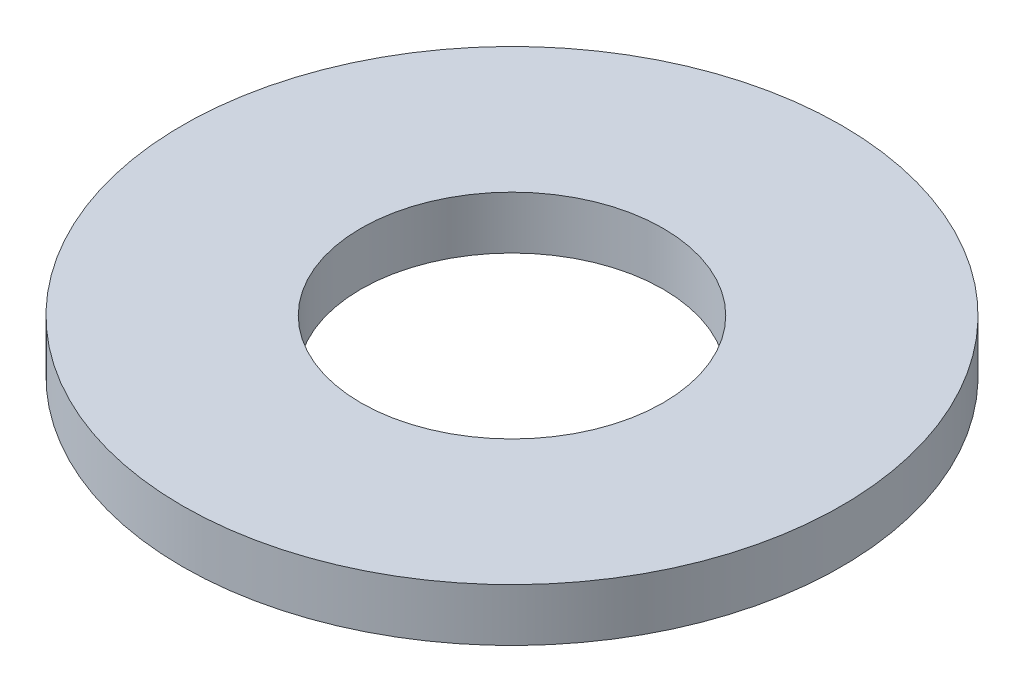
ISO-10303-21;
HEADER;
FILE_DESCRIPTION(('STEP AP214'),'2;1');
FILE_NAME('part.step','',(''),(''),'','','');
FILE_SCHEMA(('AUTOMOTIVE_DESIGN { 1 0 10303 214 1 1 1 1 }'));
ENDSEC;
DATA;
#1=APPLICATION_CONTEXT('core data for automotive mechanical design processes');
#2=APPLICATION_PROTOCOL_DEFINITION('international standard','automotive_design',2000,#1);
#3=PRODUCT_CONTEXT('',#1,'mechanical');
#4=PRODUCT('Part','Part','',(#3));
#5=PRODUCT_RELATED_PRODUCT_CATEGORY('part','',(#4));
#6=PRODUCT_DEFINITION_FORMATION('','',#4);
#7=PRODUCT_DEFINITION_CONTEXT('part definition',#1,'design');
#8=PRODUCT_DEFINITION('design','',#6,#7);
#9=PRODUCT_DEFINITION_SHAPE('','',#8);
#10=(LENGTH_UNIT() NAMED_UNIT(*) SI_UNIT(.MILLI.,.METRE.));
#11=(NAMED_UNIT(*) PLANE_ANGLE_UNIT() SI_UNIT($,.RADIAN.));
#12=(NAMED_UNIT(*) SI_UNIT($,.STERADIAN.) SOLID_ANGLE_UNIT());
#13=UNCERTAINTY_MEASURE_WITH_UNIT(LENGTH_MEASURE(1.E-05),#10,'distance_accuracy_value','');
#14=(GEOMETRIC_REPRESENTATION_CONTEXT(3) GLOBAL_UNCERTAINTY_ASSIGNED_CONTEXT((#13)) GLOBAL_UNIT_ASSIGNED_CONTEXT((#10,
#11,#12)) REPRESENTATION_CONTEXT('',''));
#15=CARTESIAN_POINT('',(0.,0.,0.));
#16=DIRECTION('',(0.,0.,1.));
#17=DIRECTION('',(1.,0.,0.));
#18=AXIS2_PLACEMENT_3D('',#15,#16,#17);
#19=CARTESIAN_POINT('',(0.,1.524,0.));
#20=DIRECTION('',(0.,-1.,0.));
#21=DIRECTION('',(0.,0.,-1.));
#22=AXIS2_PLACEMENT_3D('',#19,#20,#21);
#23=CYLINDRICAL_SURFACE('',#22,9.525);
#24=CARTESIAN_POINT('',(0.,1.524,0.));
#25=DIRECTION('',(0.,1.,0.));
#26=DIRECTION('',(0.,0.,1.));
#27=AXIS2_PLACEMENT_3D('',#24,#25,#26);
#28=CIRCLE('',#27,9.525);
#29=CARTESIAN_POINT('',(0.,1.524,-9.525));
#30=VERTEX_POINT('',#29);
#31=EDGE_CURVE('E10',#30,#30,#28,.T.);
#32=CARTESIAN_POINT('',(0.,0.,0.));
#33=DIRECTION('',(0.,1.,0.));
#34=DIRECTION('',(0.,0.,1.));
#35=AXIS2_PLACEMENT_3D('',#32,#33,#34);
#36=CIRCLE('',#35,9.525);
#37=CARTESIAN_POINT('',(0.,0.,-9.525));
#38=VERTEX_POINT('',#37);
#39=EDGE_CURVE('E40',#38,#38,#36,.T.);
#40=CARTESIAN_POINT('',(0.,1.524,-9.525));
#41=CARTESIAN_POINT('',(0.,1.508125,-9.525));
#42=CARTESIAN_POINT('',(0.,1.49225,-9.525));
#43=CARTESIAN_POINT('',(0.,1.4605,-9.525));
#44=CARTESIAN_POINT('',(0.,1.444625,-9.525));
#45=CARTESIAN_POINT('',(0.,1.412875,-9.525));
#46=CARTESIAN_POINT('',(0.,1.397,-9.525));
#47=CARTESIAN_POINT('',(0.,1.36525,-9.525));
#48=CARTESIAN_POINT('',(0.,1.349375,-9.525));
#49=CARTESIAN_POINT('',(0.,1.317625,-9.525));
#50=CARTESIAN_POINT('',(0.,1.30175,-9.525));
#51=CARTESIAN_POINT('',(0.,1.27,-9.525));
#52=CARTESIAN_POINT('',(0.,1.254125,-9.525));
#53=CARTESIAN_POINT('',(0.,1.222375,-9.525));
#54=CARTESIAN_POINT('',(0.,1.2065,-9.525));
#55=CARTESIAN_POINT('',(0.,1.17475,-9.525));
#56=CARTESIAN_POINT('',(0.,1.158875,-9.525));
#57=CARTESIAN_POINT('',(0.,1.127125,-9.525));
#58=CARTESIAN_POINT('',(0.,1.11125,-9.525));
#59=CARTESIAN_POINT('',(0.,1.0795,-9.525));
#60=CARTESIAN_POINT('',(0.,1.063625,-9.525));
#61=CARTESIAN_POINT('',(0.,1.031875,-9.525));
#62=CARTESIAN_POINT('',(0.,1.016,-9.525));
#63=CARTESIAN_POINT('',(0.,0.98425,-9.525));
#64=CARTESIAN_POINT('',(0.,0.968375,-9.525));
#65=CARTESIAN_POINT('',(0.,0.936625,-9.525));
#66=CARTESIAN_POINT('',(0.,0.92075,-9.525));
#67=CARTESIAN_POINT('',(0.,0.889,-9.525));
#68=CARTESIAN_POINT('',(0.,0.873125,-9.525));
#69=CARTESIAN_POINT('',(0.,0.841375,-9.525));
#70=CARTESIAN_POINT('',(0.,0.8255,-9.525));
#71=CARTESIAN_POINT('',(0.,0.79375,-9.525));
#72=CARTESIAN_POINT('',(0.,0.777875,-9.525));
#73=CARTESIAN_POINT('',(0.,0.746125,-9.525));
#74=CARTESIAN_POINT('',(0.,0.73025,-9.525));
#75=CARTESIAN_POINT('',(0.,0.6985,-9.525));
#76=CARTESIAN_POINT('',(0.,0.682625,-9.525));
#77=CARTESIAN_POINT('',(0.,0.650875,-9.525));
#78=CARTESIAN_POINT('',(0.,0.635,-9.525));
#79=CARTESIAN_POINT('',(0.,0.60325,-9.525));
#80=CARTESIAN_POINT('',(0.,0.587375,-9.525));
#81=CARTESIAN_POINT('',(0.,0.555625,-9.525));
#82=CARTESIAN_POINT('',(0.,0.53975,-9.525));
#83=CARTESIAN_POINT('',(0.,0.508,-9.525));
#84=CARTESIAN_POINT('',(0.,0.492125,-9.525));
#85=CARTESIAN_POINT('',(0.,0.460375,-9.525));
#86=CARTESIAN_POINT('',(0.,0.4445,-9.525));
#87=CARTESIAN_POINT('',(0.,0.41275,-9.525));
#88=CARTESIAN_POINT('',(0.,0.396875,-9.525));
#89=CARTESIAN_POINT('',(0.,0.365125,-9.525));
#90=CARTESIAN_POINT('',(0.,0.34925,-9.525));
#91=CARTESIAN_POINT('',(0.,0.3175,-9.525));
#92=CARTESIAN_POINT('',(0.,0.301625,-9.525));
#93=CARTESIAN_POINT('',(0.,0.269875,-9.525));
#94=CARTESIAN_POINT('',(0.,0.254,-9.525));
#95=CARTESIAN_POINT('',(0.,0.22225,-9.525));
#96=CARTESIAN_POINT('',(0.,0.206375,-9.525));
#97=CARTESIAN_POINT('',(0.,0.174625,-9.525));
#98=CARTESIAN_POINT('',(0.,0.15875,-9.525));
#99=CARTESIAN_POINT('',(0.,0.127,-9.525));
#100=CARTESIAN_POINT('',(0.,0.111125,-9.525));
#101=CARTESIAN_POINT('',(0.,0.079375,-9.525));
#102=CARTESIAN_POINT('',(0.,0.0635,-9.525));
#103=CARTESIAN_POINT('',(0.,0.0317499999999999,-9.525));
#104=CARTESIAN_POINT('',(0.,0.015875,-9.525));
#105=CARTESIAN_POINT('',(0.,0.,-9.525));
#106=B_SPLINE_CURVE_WITH_KNOTS('',3,(#40,#41,#42,#43,#44,#45,#46,#47,#48,#49,#50,#51,#52,#53,
#54,#55,#56,#57,#58,#59,#60,#61,#62,#63,#64,#65,#66,#67,#68,#69,#70,#71,#72,#73,#74,#75,#76,#77,
#78,#79,#80,#81,#82,#83,#84,#85,#86,#87,#88,#89,#90,#91,#92,#93,#94,#95,#96,#97,#98,#99,#100,
#101,#102,#103,#104,#105),.UNSPECIFIED.,.F.,.F.,(4,2,2,2,2,2,2,2,2,2,2,2,2,2,2,2,2,2,2,2,2,2,2,
2,2,2,2,2,2,2,2,2,4),(0.,0.0476250000000001,0.0952500000000001,0.142875,0.1905,0.238125,0.28575,
0.333375,0.381,0.428625,0.47625,0.523875,0.5715,0.619125,0.66675,0.714375,0.762,0.809625,
0.85725,0.904875,0.9525,1.000125,1.04775,1.095375,1.143,1.190625,1.23825,1.285875,1.3335,
1.381125,1.42875,1.476375,1.524),.UNSPECIFIED.);
#107=EDGE_CURVE('BSEAM37',#30,#38,#106,.T.);
#108=ORIENTED_EDGE('',*,*,#31,.F.);
#109=ORIENTED_EDGE('',*,*,#39,.T.);
#110=ORIENTED_EDGE('',*,*,#107,.T.);
#111=ORIENTED_EDGE('',*,*,#107,.F.);
#112=EDGE_LOOP('',(#108,#110,#109,#111));
#113=FACE_BOUND('',#112,.T.);
#114=ADVANCED_FACE('F37',(#113),#23,.T.);
#115=CARTESIAN_POINT('',(0.,1.524,0.));
#116=DIRECTION('',(0.,1.,0.));
#117=DIRECTION('',(0.,0.,1.));
#118=AXIS2_PLACEMENT_3D('',#115,#116,#117);
#119=PLANE('',#118);
#120=CARTESIAN_POINT('',(0.,1.524,0.));
#121=DIRECTION('',(0.,1.,0.));
#122=DIRECTION('',(0.,0.,1.));
#123=AXIS2_PLACEMENT_3D('',#120,#121,#122);
#124=CIRCLE('',#123,4.3688);
#125=CARTESIAN_POINT('',(0.,1.524,4.3688));
#126=VERTEX_POINT('',#125);
#127=EDGE_CURVE('E49',#126,#126,#124,.T.);
#128=ORIENTED_EDGE('',*,*,#127,.F.);
#129=EDGE_LOOP('',(#128));
#130=FACE_BOUND('',#129,.T.);
#131=ORIENTED_EDGE('',*,*,#31,.T.);
#132=EDGE_LOOP('',(#131));
#133=FACE_BOUND('',#132,.T.);
#134=ADVANCED_FACE('F64',(#130,#133),#119,.T.);
#135=CARTESIAN_POINT('',(0.,0.,0.));
#136=DIRECTION('',(0.,1.,0.));
#137=DIRECTION('',(0.,0.,1.));
#138=AXIS2_PLACEMENT_3D('',#135,#136,#137);
#139=PLANE('',#138);
#140=CARTESIAN_POINT('',(0.,0.,0.));
#141=DIRECTION('',(0.,1.,0.));
#142=DIRECTION('',(0.,0.,1.));
#143=AXIS2_PLACEMENT_3D('',#140,#141,#142);
#144=CIRCLE('',#143,4.3688);
#145=CARTESIAN_POINT('',(0.,0.,4.3688));
#146=VERTEX_POINT('',#145);
#147=EDGE_CURVE('E47',#146,#146,#144,.T.);
#148=ORIENTED_EDGE('',*,*,#147,.T.);
#149=EDGE_LOOP('',(#148));
#150=FACE_BOUND('',#149,.T.);
#151=ORIENTED_EDGE('',*,*,#39,.F.);
#152=EDGE_LOOP('',(#151));
#153=FACE_BOUND('',#152,.T.);
#154=ADVANCED_FACE('F55',(#150,#153),#139,.F.);
#155=CARTESIAN_POINT('',(0.,0.,0.));
#156=DIRECTION('',(0.,1.,0.));
#157=DIRECTION('',(0.,0.,1.));
#158=AXIS2_PLACEMENT_3D('',#155,#156,#157);
#159=CYLINDRICAL_SURFACE('',#158,4.3688);
#160=CARTESIAN_POINT('',(0.,0.,4.3688));
#161=CARTESIAN_POINT('',(0.,0.015875,4.3688));
#162=CARTESIAN_POINT('',(0.,0.03175,4.3688));
#163=CARTESIAN_POINT('',(0.,0.0635,4.3688));
#164=CARTESIAN_POINT('',(0.,0.079375,4.3688));
#165=CARTESIAN_POINT('',(0.,0.111125,4.3688));
#166=CARTESIAN_POINT('',(0.,0.127,4.3688));
#167=CARTESIAN_POINT('',(0.,0.15875,4.3688));
#168=CARTESIAN_POINT('',(0.,0.174625,4.3688));
#169=CARTESIAN_POINT('',(0.,0.206375,4.3688));
#170=CARTESIAN_POINT('',(0.,0.22225,4.3688));
#171=CARTESIAN_POINT('',(0.,0.254,4.3688));
#172=CARTESIAN_POINT('',(0.,0.269875,4.3688));
#173=CARTESIAN_POINT('',(0.,0.301625,4.3688));
#174=CARTESIAN_POINT('',(0.,0.3175,4.3688));
#175=CARTESIAN_POINT('',(0.,0.34925,4.3688));
#176=CARTESIAN_POINT('',(0.,0.365125,4.3688));
#177=CARTESIAN_POINT('',(0.,0.396875,4.3688));
#178=CARTESIAN_POINT('',(0.,0.41275,4.3688));
#179=CARTESIAN_POINT('',(0.,0.4445,4.3688));
#180=CARTESIAN_POINT('',(0.,0.460375,4.3688));
#181=CARTESIAN_POINT('',(0.,0.492125,4.3688));
#182=CARTESIAN_POINT('',(0.,0.508,4.3688));
#183=CARTESIAN_POINT('',(0.,0.53975,4.3688));
#184=CARTESIAN_POINT('',(0.,0.555625,4.3688));
#185=CARTESIAN_POINT('',(0.,0.587375,4.3688));
#186=CARTESIAN_POINT('',(0.,0.60325,4.3688));
#187=CARTESIAN_POINT('',(0.,0.635,4.3688));
#188=CARTESIAN_POINT('',(0.,0.650875,4.3688));
#189=CARTESIAN_POINT('',(0.,0.682625,4.3688));
#190=CARTESIAN_POINT('',(0.,0.6985,4.3688));
#191=CARTESIAN_POINT('',(0.,0.73025,4.3688));
#192=CARTESIAN_POINT('',(0.,0.746125,4.3688));
#193=CARTESIAN_POINT('',(0.,0.777875,4.3688));
#194=CARTESIAN_POINT('',(0.,0.79375,4.3688));
#195=CARTESIAN_POINT('',(0.,0.8255,4.3688));
#196=CARTESIAN_POINT('',(0.,0.841375,4.3688));
#197=CARTESIAN_POINT('',(0.,0.873125,4.3688));
#198=CARTESIAN_POINT('',(0.,0.889,4.3688));
#199=CARTESIAN_POINT('',(0.,0.92075,4.3688));
#200=CARTESIAN_POINT('',(0.,0.936625,4.3688));
#201=CARTESIAN_POINT('',(0.,0.968375,4.3688));
#202=CARTESIAN_POINT('',(0.,0.98425,4.3688));
#203=CARTESIAN_POINT('',(0.,1.016,4.3688));
#204=CARTESIAN_POINT('',(0.,1.031875,4.3688));
#205=CARTESIAN_POINT('',(0.,1.063625,4.3688));
#206=CARTESIAN_POINT('',(0.,1.0795,4.3688));
#207=CARTESIAN_POINT('',(0.,1.11125,4.3688));
#208=CARTESIAN_POINT('',(0.,1.127125,4.3688));
#209=CARTESIAN_POINT('',(0.,1.158875,4.3688));
#210=CARTESIAN_POINT('',(0.,1.17475,4.3688));
#211=CARTESIAN_POINT('',(0.,1.2065,4.3688));
#212=CARTESIAN_POINT('',(0.,1.222375,4.3688));
#213=CARTESIAN_POINT('',(0.,1.254125,4.3688));
#214=CARTESIAN_POINT('',(0.,1.27,4.3688));
#215=CARTESIAN_POINT('',(0.,1.30175,4.3688));
#216=CARTESIAN_POINT('',(0.,1.317625,4.3688));
#217=CARTESIAN_POINT('',(0.,1.349375,4.3688));
#218=CARTESIAN_POINT('',(0.,1.36525,4.3688));
#219=CARTESIAN_POINT('',(0.,1.397,4.3688));
#220=CARTESIAN_POINT('',(0.,1.412875,4.3688));
#221=CARTESIAN_POINT('',(0.,1.444625,4.3688));
#222=CARTESIAN_POINT('',(0.,1.4605,4.3688));
#223=CARTESIAN_POINT('',(0.,1.49225,4.3688));
#224=CARTESIAN_POINT('',(0.,1.508125,4.3688));
#225=CARTESIAN_POINT('',(0.,1.524,4.3688));
#226=B_SPLINE_CURVE_WITH_KNOTS('',3,(#160,#161,#162,#163,#164,#165,#166,#167,#168,#169,#170,
#171,#172,#173,#174,#175,#176,#177,#178,#179,#180,#181,#182,#183,#184,#185,#186,#187,#188,#189,
#190,#191,#192,#193,#194,#195,#196,#197,#198,#199,#200,#201,#202,#203,#204,#205,#206,#207,#208,
#209,#210,#211,#212,#213,#214,#215,#216,#217,#218,#219,#220,#221,#222,#223,#224,#225),
.UNSPECIFIED.,.F.,.F.,(4,2,2,2,2,2,2,2,2,2,2,2,2,2,2,2,2,2,2,2,2,2,2,2,2,2,2,2,2,2,2,2,4),(0.,
0.047625,0.09525,0.142875,0.1905,0.238125,0.28575,0.333375,0.381,0.428625,0.47625,0.523875,
0.5715,0.619125,0.66675,0.714375,0.762,0.809625,0.85725,0.904875,0.9525,1.000125,1.04775,
1.095375,1.143,1.190625,1.23825,1.285875,1.3335,1.381125,1.42875,1.476375,1.524),.UNSPECIFIED.);
#227=EDGE_CURVE('BSEAM58',#146,#126,#226,.T.);
#228=ORIENTED_EDGE('',*,*,#147,.F.);
#229=ORIENTED_EDGE('',*,*,#127,.T.);
#230=ORIENTED_EDGE('',*,*,#227,.T.);
#231=ORIENTED_EDGE('',*,*,#227,.F.);
#232=EDGE_LOOP('',(#228,#230,#229,#231));
#233=FACE_BOUND('',#232,.T.);
#234=ADVANCED_FACE('F58',(#233),#159,.F.);
#235=CLOSED_SHELL('',(#114,#134,#154,#234));
#236=MANIFOLD_SOLID_BREP('B2',#235);
#237=ADVANCED_BREP_SHAPE_REPRESENTATION('',(#18,#236),#14);
#238=SHAPE_DEFINITION_REPRESENTATION(#9,#237);
ENDSEC;
END-ISO-10303-21;
